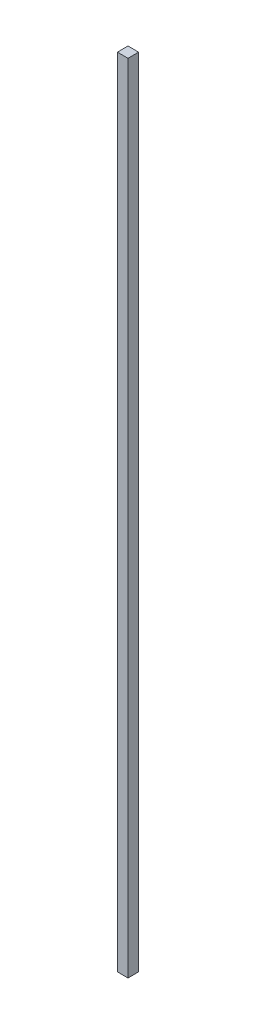
ISO-10303-21;
HEADER;
FILE_DESCRIPTION(('STEP AP214'),'2;1');
FILE_NAME('part.step','',(''),(''),'','','');
FILE_SCHEMA(('AUTOMOTIVE_DESIGN { 1 0 10303 214 1 1 1 1 }'));
ENDSEC;
DATA;
#1=APPLICATION_CONTEXT('core data for automotive mechanical design processes');
#2=APPLICATION_PROTOCOL_DEFINITION('international standard','automotive_design',2000,#1);
#3=PRODUCT_CONTEXT('',#1,'mechanical');
#4=PRODUCT('Part','Part','',(#3));
#5=PRODUCT_RELATED_PRODUCT_CATEGORY('part','',(#4));
#6=PRODUCT_DEFINITION_FORMATION('','',#4);
#7=PRODUCT_DEFINITION_CONTEXT('part definition',#1,'design');
#8=PRODUCT_DEFINITION('design','',#6,#7);
#9=PRODUCT_DEFINITION_SHAPE('','',#8);
#10=(LENGTH_UNIT() NAMED_UNIT(*) SI_UNIT(.MILLI.,.METRE.));
#11=(NAMED_UNIT(*) PLANE_ANGLE_UNIT() SI_UNIT($,.RADIAN.));
#12=(NAMED_UNIT(*) SI_UNIT($,.STERADIAN.) SOLID_ANGLE_UNIT());
#13=UNCERTAINTY_MEASURE_WITH_UNIT(LENGTH_MEASURE(1.E-05),#10,'distance_accuracy_value','');
#14=(GEOMETRIC_REPRESENTATION_CONTEXT(3) GLOBAL_UNCERTAINTY_ASSIGNED_CONTEXT((#13)) GLOBAL_UNIT_ASSIGNED_CONTEXT((#10,
#11,#12)) REPRESENTATION_CONTEXT('',''));
#15=CARTESIAN_POINT('',(0.,0.,0.));
#16=DIRECTION('',(0.,0.,1.));
#17=DIRECTION('',(1.,0.,0.));
#18=AXIS2_PLACEMENT_3D('',#15,#16,#17);
#19=CARTESIAN_POINT('',(-16.0788177339902,3000.,-23.2728428412522));
#20=DIRECTION('',(1.,0.,0.));
#21=DIRECTION('',(0.,0.,-1.));
#22=AXIS2_PLACEMENT_3D('',#19,#20,#21);
#23=PLANE('',#22);
#24=DIRECTION('',(0.,0.,1.));
#25=VECTOR('',#24,1.);
#26=CARTESIAN_POINT('',(-16.0788177339902,0.,-23.2728428412522));
#27=LINE('',#26,#25);
#28=CARTESIAN_POINT('',(-16.0788177339902,0.,-23.2728428412522));
#29=VERTEX_POINT('',#28);
#30=CARTESIAN_POINT('',(-16.0788177339902,0.,16.7271571587478));
#31=VERTEX_POINT('',#30);
#32=EDGE_CURVE('E100',#29,#31,#27,.T.);
#33=ORIENTED_EDGE('',*,*,#32,.T.);
#34=DIRECTION('',(0.,-1.,0.));
#35=VECTOR('',#34,1.);
#36=CARTESIAN_POINT('',(-16.0788177339902,3000.,16.7271571587478));
#37=LINE('',#36,#35);
#38=CARTESIAN_POINT('',(-16.0788177339902,3000.,16.7271571587478));
#39=VERTEX_POINT('',#38);
#40=EDGE_CURVE('E11',#39,#31,#37,.T.);
#41=ORIENTED_EDGE('',*,*,#40,.F.);
#42=DIRECTION('',(0.,0.,1.));
#43=VECTOR('',#42,1.);
#44=CARTESIAN_POINT('',(-16.0788177339902,3000.,-23.2728428412522));
#45=LINE('',#44,#43);
#46=CARTESIAN_POINT('',(-16.0788177339902,3000.,-23.2728428412522));
#47=VERTEX_POINT('',#46);
#48=EDGE_CURVE('E88',#47,#39,#45,.T.);
#49=ORIENTED_EDGE('',*,*,#48,.F.);
#50=DIRECTION('',(0.,-1.,0.));
#51=VECTOR('',#50,1.);
#52=CARTESIAN_POINT('',(-16.0788177339902,3000.,-23.2728428412522));
#53=LINE('',#52,#51);
#54=EDGE_CURVE('E96',#47,#29,#53,.T.);
#55=ORIENTED_EDGE('',*,*,#54,.T.);
#56=EDGE_LOOP('',(#33,#41,#49,#55));
#57=FACE_BOUND('',#56,.T.);
#58=ADVANCED_FACE('F37',(#57),#23,.F.);
#59=CARTESIAN_POINT('',(-16.0788177339902,3000.,16.7271571587478));
#60=DIRECTION('',(0.,0.,-1.));
#61=DIRECTION('',(-1.,0.,0.));
#62=AXIS2_PLACEMENT_3D('',#59,#60,#61);
#63=PLANE('',#62);
#64=DIRECTION('',(1.,0.,0.));
#65=VECTOR('',#64,1.);
#66=CARTESIAN_POINT('',(-16.0788177339902,0.,16.7271571587478));
#67=LINE('',#66,#65);
#68=CARTESIAN_POINT('',(23.9211822660098,0.,16.7271571587478));
#69=VERTEX_POINT('',#68);
#70=EDGE_CURVE('E92',#31,#69,#67,.T.);
#71=ORIENTED_EDGE('',*,*,#70,.T.);
#72=DIRECTION('',(0.,-1.,0.));
#73=VECTOR('',#72,1.);
#74=CARTESIAN_POINT('',(23.9211822660098,3000.,16.7271571587478));
#75=LINE('',#74,#73);
#76=CARTESIAN_POINT('',(23.9211822660098,3000.,16.7271571587478));
#77=VERTEX_POINT('',#76);
#78=EDGE_CURVE('E45',#77,#69,#75,.T.);
#79=ORIENTED_EDGE('',*,*,#78,.F.);
#80=DIRECTION('',(1.,0.,0.));
#81=VECTOR('',#80,1.);
#82=CARTESIAN_POINT('',(-16.0788177339902,3000.,16.7271571587478));
#83=LINE('',#82,#81);
#84=EDGE_CURVE('E83',#39,#77,#83,.T.);
#85=ORIENTED_EDGE('',*,*,#84,.F.);
#86=ORIENTED_EDGE('',*,*,#40,.T.);
#87=EDGE_LOOP('',(#71,#79,#85,#86));
#88=FACE_BOUND('',#87,.T.);
#89=ADVANCED_FACE('F91',(#88),#63,.F.);
#90=CARTESIAN_POINT('',(23.9211822660098,3000.,-23.2728428412522));
#91=DIRECTION('',(-1.,0.,0.));
#92=DIRECTION('',(0.,0.,1.));
#93=AXIS2_PLACEMENT_3D('',#90,#91,#92);
#94=PLANE('',#93);
#95=DIRECTION('',(0.,0.,-1.));
#96=VECTOR('',#95,1.);
#97=CARTESIAN_POINT('',(23.9211822660098,0.,-23.2728428412522));
#98=LINE('',#97,#96);
#99=CARTESIAN_POINT('',(23.9211822660098,0.,-23.2728428412522));
#100=VERTEX_POINT('',#99);
#101=EDGE_CURVE('E70',#69,#100,#98,.T.);
#102=ORIENTED_EDGE('',*,*,#101,.T.);
#103=DIRECTION('',(0.,-1.,0.));
#104=VECTOR('',#103,1.);
#105=CARTESIAN_POINT('',(23.9211822660098,3000.,-23.2728428412522));
#106=LINE('',#105,#104);
#107=CARTESIAN_POINT('',(23.9211822660098,3000.,-23.2728428412522));
#108=VERTEX_POINT('',#107);
#109=EDGE_CURVE('E93',#108,#100,#106,.T.);
#110=ORIENTED_EDGE('',*,*,#109,.F.);
#111=DIRECTION('',(0.,0.,-1.));
#112=VECTOR('',#111,1.);
#113=CARTESIAN_POINT('',(23.9211822660098,3000.,-23.2728428412522));
#114=LINE('',#113,#112);
#115=EDGE_CURVE('E86',#77,#108,#114,.T.);
#116=ORIENTED_EDGE('',*,*,#115,.F.);
#117=ORIENTED_EDGE('',*,*,#78,.T.);
#118=EDGE_LOOP('',(#102,#110,#116,#117));
#119=FACE_BOUND('',#118,.T.);
#120=ADVANCED_FACE('F94',(#119),#94,.F.);
#121=CARTESIAN_POINT('',(-16.0788177339902,3000.,-23.2728428412522));
#122=DIRECTION('',(0.,0.,1.));
#123=DIRECTION('',(1.,0.,0.));
#124=AXIS2_PLACEMENT_3D('',#121,#122,#123);
#125=PLANE('',#124);
#126=DIRECTION('',(-1.,0.,0.));
#127=VECTOR('',#126,1.);
#128=CARTESIAN_POINT('',(-16.0788177339902,0.,-23.2728428412522));
#129=LINE('',#128,#127);
#130=EDGE_CURVE('E76',#100,#29,#129,.T.);
#131=ORIENTED_EDGE('',*,*,#130,.T.);
#132=ORIENTED_EDGE('',*,*,#54,.F.);
#133=DIRECTION('',(-1.,0.,0.));
#134=VECTOR('',#133,1.);
#135=CARTESIAN_POINT('',(-16.0788177339902,3000.,-23.2728428412522));
#136=LINE('',#135,#134);
#137=EDGE_CURVE('E53',#108,#47,#136,.T.);
#138=ORIENTED_EDGE('',*,*,#137,.F.);
#139=ORIENTED_EDGE('',*,*,#109,.T.);
#140=EDGE_LOOP('',(#131,#132,#138,#139));
#141=FACE_BOUND('',#140,.T.);
#142=ADVANCED_FACE('F107',(#141),#125,.F.);
#143=CARTESIAN_POINT('',(0.,3000.,0.));
#144=DIRECTION('',(0.,1.,0.));
#145=DIRECTION('',(0.,0.,1.));
#146=AXIS2_PLACEMENT_3D('',#143,#144,#145);
#147=PLANE('',#146);
#148=ORIENTED_EDGE('',*,*,#48,.T.);
#149=ORIENTED_EDGE('',*,*,#84,.T.);
#150=ORIENTED_EDGE('',*,*,#115,.T.);
#151=ORIENTED_EDGE('',*,*,#137,.T.);
#152=EDGE_LOOP('',(#148,#149,#150,#151));
#153=FACE_BOUND('',#152,.T.);
#154=ADVANCED_FACE('F84',(#153),#147,.T.);
#155=CARTESIAN_POINT('',(0.,0.,0.));
#156=DIRECTION('',(0.,1.,0.));
#157=DIRECTION('',(0.,0.,1.));
#158=AXIS2_PLACEMENT_3D('',#155,#156,#157);
#159=PLANE('',#158);
#160=ORIENTED_EDGE('',*,*,#32,.F.);
#161=ORIENTED_EDGE('',*,*,#130,.F.);
#162=ORIENTED_EDGE('',*,*,#101,.F.);
#163=ORIENTED_EDGE('',*,*,#70,.F.);
#164=EDGE_LOOP('',(#160,#161,#162,#163));
#165=FACE_BOUND('',#164,.T.);
#166=ADVANCED_FACE('F110',(#165),#159,.F.);
#167=CLOSED_SHELL('',(#58,#89,#120,#142,#154,#166));
#168=MANIFOLD_SOLID_BREP('B2',#167);
#169=ADVANCED_BREP_SHAPE_REPRESENTATION('',(#18,#168),#14);
#170=SHAPE_DEFINITION_REPRESENTATION(#9,#169);
ENDSEC;
END-ISO-10303-21;
